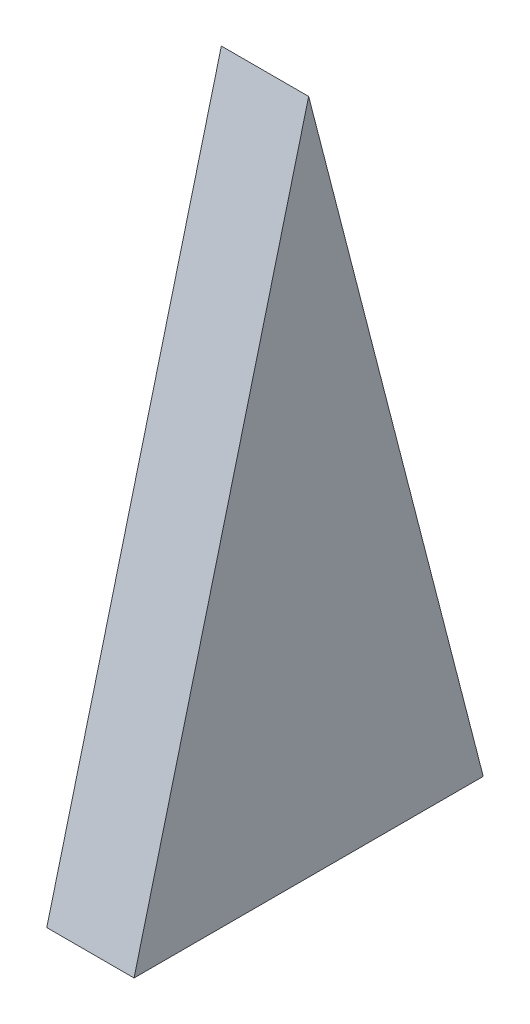
ISO-10303-21;
HEADER;
FILE_DESCRIPTION(('STEP AP214'),'2;1');
FILE_NAME('part.step','',(''),(''),'','','');
FILE_SCHEMA(('AUTOMOTIVE_DESIGN { 1 0 10303 214 1 1 1 1 }'));
ENDSEC;
DATA;
#1=APPLICATION_CONTEXT('core data for automotive mechanical design processes');
#2=APPLICATION_PROTOCOL_DEFINITION('international standard','automotive_design',2000,#1);
#3=PRODUCT_CONTEXT('',#1,'mechanical');
#4=PRODUCT('Part','Part','',(#3));
#5=PRODUCT_RELATED_PRODUCT_CATEGORY('part','',(#4));
#6=PRODUCT_DEFINITION_FORMATION('','',#4);
#7=PRODUCT_DEFINITION_CONTEXT('part definition',#1,'design');
#8=PRODUCT_DEFINITION('design','',#6,#7);
#9=PRODUCT_DEFINITION_SHAPE('','',#8);
#10=(LENGTH_UNIT() NAMED_UNIT(*) SI_UNIT(.MILLI.,.METRE.));
#11=(NAMED_UNIT(*) PLANE_ANGLE_UNIT() SI_UNIT($,.RADIAN.));
#12=(NAMED_UNIT(*) SI_UNIT($,.STERADIAN.) SOLID_ANGLE_UNIT());
#13=UNCERTAINTY_MEASURE_WITH_UNIT(LENGTH_MEASURE(1.E-05),#10,'distance_accuracy_value','');
#14=(GEOMETRIC_REPRESENTATION_CONTEXT(3) GLOBAL_UNCERTAINTY_ASSIGNED_CONTEXT((#13)) GLOBAL_UNIT_ASSIGNED_CONTEXT((#10,
#11,#12)) REPRESENTATION_CONTEXT('',''));
#15=CARTESIAN_POINT('',(0.,0.,0.));
#16=DIRECTION('',(0.,0.,1.));
#17=DIRECTION('',(1.,0.,0.));
#18=AXIS2_PLACEMENT_3D('',#15,#16,#17);
#19=CARTESIAN_POINT('',(-10.,0.,-20.));
#20=DIRECTION('',(0.,0.25,-0.968245836551854));
#21=DIRECTION('',(0.,0.968245836551854,0.25));
#22=AXIS2_PLACEMENT_3D('',#19,#20,#21);
#23=PLANE('',#22);
#24=DIRECTION('',(0.,0.968245836551854,0.25));
#25=VECTOR('',#24,1.);
#26=CARTESIAN_POINT('',(0.,0.,-20.));
#27=LINE('',#26,#25);
#28=CARTESIAN_POINT('',(0.,0.,-20.));
#29=VERTEX_POINT('',#28);
#30=CARTESIAN_POINT('',(0.,77.4596669241483,0.));
#31=VERTEX_POINT('',#30);
#32=EDGE_CURVE('E85',#29,#31,#27,.T.);
#33=ORIENTED_EDGE('',*,*,#32,.F.);
#34=DIRECTION('',(1.,0.,0.));
#35=VECTOR('',#34,1.);
#36=CARTESIAN_POINT('',(-10.,0.,-20.));
#37=LINE('',#36,#35);
#38=CARTESIAN_POINT('',(-10.,0.,-20.));
#39=VERTEX_POINT('',#38);
#40=EDGE_CURVE('E11',#39,#29,#37,.T.);
#41=ORIENTED_EDGE('',*,*,#40,.F.);
#42=DIRECTION('',(0.,0.968245836551854,0.25));
#43=VECTOR('',#42,1.);
#44=CARTESIAN_POINT('',(-10.,0.,-20.));
#45=LINE('',#44,#43);
#46=CARTESIAN_POINT('',(-10.,77.4596669241483,0.));
#47=VERTEX_POINT('',#46);
#48=EDGE_CURVE('E77',#39,#47,#45,.T.);
#49=ORIENTED_EDGE('',*,*,#48,.T.);
#50=DIRECTION('',(1.,0.,0.));
#51=VECTOR('',#50,1.);
#52=CARTESIAN_POINT('',(-10.,77.4596669241483,0.));
#53=LINE('',#52,#51);
#54=EDGE_CURVE('E36',#47,#31,#53,.T.);
#55=ORIENTED_EDGE('',*,*,#54,.T.);
#56=EDGE_LOOP('',(#33,#41,#49,#55));
#57=FACE_BOUND('',#56,.T.);
#58=ADVANCED_FACE('F33',(#57),#23,.T.);
#59=CARTESIAN_POINT('',(-10.,0.,20.));
#60=DIRECTION('',(0.,-1.,0.));
#61=DIRECTION('',(0.,0.,-1.));
#62=AXIS2_PLACEMENT_3D('',#59,#60,#61);
#63=PLANE('',#62);
#64=DIRECTION('',(0.,0.,-1.));
#65=VECTOR('',#64,1.);
#66=CARTESIAN_POINT('',(0.,0.,20.));
#67=LINE('',#66,#65);
#68=CARTESIAN_POINT('',(0.,0.,20.));
#69=VERTEX_POINT('',#68);
#70=EDGE_CURVE('E79',#69,#29,#67,.T.);
#71=ORIENTED_EDGE('',*,*,#70,.F.);
#72=DIRECTION('',(1.,0.,0.));
#73=VECTOR('',#72,1.);
#74=CARTESIAN_POINT('',(-10.,0.,20.));
#75=LINE('',#74,#73);
#76=CARTESIAN_POINT('',(-10.,0.,20.));
#77=VERTEX_POINT('',#76);
#78=EDGE_CURVE('E42',#77,#69,#75,.T.);
#79=ORIENTED_EDGE('',*,*,#78,.F.);
#80=DIRECTION('',(0.,0.,-1.));
#81=VECTOR('',#80,1.);
#82=CARTESIAN_POINT('',(-10.,0.,20.));
#83=LINE('',#82,#81);
#84=EDGE_CURVE('E74',#77,#39,#83,.T.);
#85=ORIENTED_EDGE('',*,*,#84,.T.);
#86=ORIENTED_EDGE('',*,*,#40,.T.);
#87=EDGE_LOOP('',(#71,#79,#85,#86));
#88=FACE_BOUND('',#87,.T.);
#89=ADVANCED_FACE('F89',(#88),#63,.T.);
#90=CARTESIAN_POINT('',(-10.,77.4596669241483,0.));
#91=DIRECTION('',(0.,0.25,0.968245836551854));
#92=DIRECTION('',(0.,-0.968245836551854,0.25));
#93=AXIS2_PLACEMENT_3D('',#90,#91,#92);
#94=PLANE('',#93);
#95=DIRECTION('',(0.,-0.968245836551854,0.25));
#96=VECTOR('',#95,1.);
#97=CARTESIAN_POINT('',(0.,77.4596669241483,0.));
#98=LINE('',#97,#96);
#99=EDGE_CURVE('E72',#31,#69,#98,.T.);
#100=ORIENTED_EDGE('',*,*,#99,.F.);
#101=ORIENTED_EDGE('',*,*,#54,.F.);
#102=DIRECTION('',(0.,-0.968245836551854,0.25));
#103=VECTOR('',#102,1.);
#104=CARTESIAN_POINT('',(-10.,77.4596669241483,0.));
#105=LINE('',#104,#103);
#106=EDGE_CURVE('E70',#47,#77,#105,.T.);
#107=ORIENTED_EDGE('',*,*,#106,.T.);
#108=ORIENTED_EDGE('',*,*,#78,.T.);
#109=EDGE_LOOP('',(#100,#101,#107,#108));
#110=FACE_BOUND('',#109,.T.);
#111=ADVANCED_FACE('F69',(#110),#94,.T.);
#112=CARTESIAN_POINT('',(-10.,0.,0.));
#113=DIRECTION('',(-1.,0.,0.));
#114=DIRECTION('',(0.,0.,1.));
#115=AXIS2_PLACEMENT_3D('',#112,#113,#114);
#116=PLANE('',#115);
#117=ORIENTED_EDGE('',*,*,#48,.F.);
#118=ORIENTED_EDGE('',*,*,#84,.F.);
#119=ORIENTED_EDGE('',*,*,#106,.F.);
#120=EDGE_LOOP('',(#117,#118,#119));
#121=FACE_BOUND('',#120,.T.);
#122=ADVANCED_FACE('F76',(#121),#116,.T.);
#123=CARTESIAN_POINT('',(0.,0.,0.));
#124=DIRECTION('',(-1.,0.,0.));
#125=DIRECTION('',(0.,0.,1.));
#126=AXIS2_PLACEMENT_3D('',#123,#124,#125);
#127=PLANE('',#126);
#128=ORIENTED_EDGE('',*,*,#32,.T.);
#129=ORIENTED_EDGE('',*,*,#99,.T.);
#130=ORIENTED_EDGE('',*,*,#70,.T.);
#131=EDGE_LOOP('',(#128,#129,#130));
#132=FACE_BOUND('',#131,.T.);
#133=ADVANCED_FACE('F88',(#132),#127,.F.);
#134=CLOSED_SHELL('',(#58,#89,#111,#122,#133));
#135=MANIFOLD_SOLID_BREP('B2',#134);
#136=ADVANCED_BREP_SHAPE_REPRESENTATION('',(#18,#135),#14);
#137=SHAPE_DEFINITION_REPRESENTATION(#9,#136);
ENDSEC;
END-ISO-10303-21;
